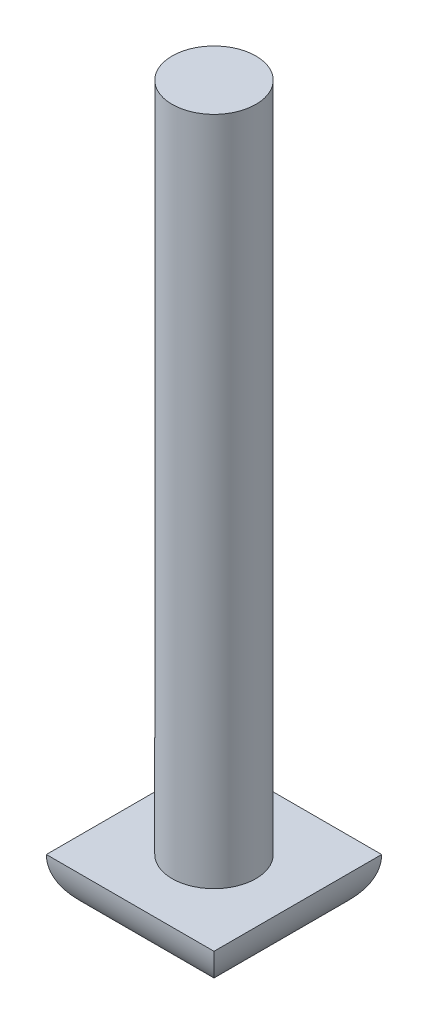
ISO-10303-21;
HEADER;
FILE_DESCRIPTION(('STEP AP214'),'2;1');
FILE_NAME('part.step','',(''),(''),'','','');
FILE_SCHEMA(('AUTOMOTIVE_DESIGN { 1 0 10303 214 1 1 1 1 }'));
ENDSEC;
DATA;
#1=APPLICATION_CONTEXT('core data for automotive mechanical design processes');
#2=APPLICATION_PROTOCOL_DEFINITION('international standard','automotive_design',2000,#1);
#3=PRODUCT_CONTEXT('',#1,'mechanical');
#4=PRODUCT('Part','Part','',(#3));
#5=PRODUCT_RELATED_PRODUCT_CATEGORY('part','',(#4));
#6=PRODUCT_DEFINITION_FORMATION('','',#4);
#7=PRODUCT_DEFINITION_CONTEXT('part definition',#1,'design');
#8=PRODUCT_DEFINITION('design','',#6,#7);
#9=PRODUCT_DEFINITION_SHAPE('','',#8);
#10=(LENGTH_UNIT() NAMED_UNIT(*) SI_UNIT(.MILLI.,.METRE.));
#11=(NAMED_UNIT(*) PLANE_ANGLE_UNIT() SI_UNIT($,.RADIAN.));
#12=(NAMED_UNIT(*) SI_UNIT($,.STERADIAN.) SOLID_ANGLE_UNIT());
#13=UNCERTAINTY_MEASURE_WITH_UNIT(LENGTH_MEASURE(1.E-05),#10,'distance_accuracy_value','');
#14=(GEOMETRIC_REPRESENTATION_CONTEXT(3) GLOBAL_UNCERTAINTY_ASSIGNED_CONTEXT((#13)) GLOBAL_UNIT_ASSIGNED_CONTEXT((#10,
#11,#12)) REPRESENTATION_CONTEXT('',''));
#15=CARTESIAN_POINT('',(0.,0.,0.));
#16=DIRECTION('',(0.,0.,1.));
#17=DIRECTION('',(1.,0.,0.));
#18=AXIS2_PLACEMENT_3D('',#15,#16,#17);
#19=CARTESIAN_POINT('',(0.,8.,0.));
#20=DIRECTION('',(0.,-1.,0.));
#21=DIRECTION('',(0.,0.,-1.));
#22=AXIS2_PLACEMENT_3D('',#19,#20,#21);
#23=PLANE('',#22);
#24=CARTESIAN_POINT('',(0.,8.00000000000001,0.));
#25=DIRECTION('',(0.,-1.,0.));
#26=DIRECTION('',(0.,0.,-1.));
#27=AXIS2_PLACEMENT_3D('',#24,#25,#26);
#28=CIRCLE('',#27,6.);
#29=CARTESIAN_POINT('',(0.,8.00000000000001,-6.));
#30=VERTEX_POINT('',#29);
#31=EDGE_CURVE('E104',#30,#30,#28,.F.);
#32=ORIENTED_EDGE('',*,*,#31,.F.);
#33=EDGE_LOOP('',(#32));
#34=FACE_BOUND('',#33,.T.);
#35=DIRECTION('',(0.,0.,-1.));
#36=VECTOR('',#35,1.);
#37=CARTESIAN_POINT('',(12.,8.,12.));
#38=LINE('',#37,#36);
#39=CARTESIAN_POINT('',(12.,8.,12.));
#40=VERTEX_POINT('',#39);
#41=CARTESIAN_POINT('',(12.,8.,-12.));
#42=VERTEX_POINT('',#41);
#43=EDGE_CURVE('E76',#40,#42,#38,.T.);
#44=ORIENTED_EDGE('',*,*,#43,.T.);
#45=DIRECTION('',(-1.,0.,0.));
#46=VECTOR('',#45,1.);
#47=CARTESIAN_POINT('',(-12.,8.,-12.));
#48=LINE('',#47,#46);
#49=CARTESIAN_POINT('',(-12.,8.,-12.));
#50=VERTEX_POINT('',#49);
#51=EDGE_CURVE('E78',#42,#50,#48,.T.);
#52=ORIENTED_EDGE('',*,*,#51,.T.);
#53=DIRECTION('',(0.,0.,1.));
#54=VECTOR('',#53,1.);
#55=CARTESIAN_POINT('',(-12.,8.,12.));
#56=LINE('',#55,#54);
#57=CARTESIAN_POINT('',(-12.,8.,12.));
#58=VERTEX_POINT('',#57);
#59=EDGE_CURVE('E92',#50,#58,#56,.T.);
#60=ORIENTED_EDGE('',*,*,#59,.T.);
#61=DIRECTION('',(1.,0.,0.));
#62=VECTOR('',#61,1.);
#63=CARTESIAN_POINT('',(-12.,8.,12.));
#64=LINE('',#63,#62);
#65=EDGE_CURVE('E80',#58,#40,#64,.T.);
#66=ORIENTED_EDGE('',*,*,#65,.T.);
#67=EDGE_LOOP('',(#44,#52,#60,#66));
#68=FACE_BOUND('',#67,.T.);
#69=ADVANCED_FACE('F33',(#34,#68),#23,.F.);
#70=CARTESIAN_POINT('',(0.,0.,0.));
#71=DIRECTION('',(0.,-1.,0.));
#72=DIRECTION('',(0.,0.,-1.));
#73=AXIS2_PLACEMENT_3D('',#70,#71,#72);
#74=PLANE('',#73);
#75=DIRECTION('',(0.,0.,-1.));
#76=VECTOR('',#75,1.);
#77=CARTESIAN_POINT('',(4.,0.,12.));
#78=LINE('',#77,#76);
#79=CARTESIAN_POINT('',(4.,0.,-4.));
#80=VERTEX_POINT('',#79);
#81=CARTESIAN_POINT('',(4.,0.,4.));
#82=VERTEX_POINT('',#81);
#83=EDGE_CURVE('E42',#80,#82,#78,.F.);
#84=ORIENTED_EDGE('',*,*,#83,.T.);
#85=DIRECTION('',(1.,0.,0.));
#86=VECTOR('',#85,1.);
#87=CARTESIAN_POINT('',(-12.,0.,4.));
#88=LINE('',#87,#86);
#89=CARTESIAN_POINT('',(-4.,0.,4.));
#90=VERTEX_POINT('',#89);
#91=EDGE_CURVE('E11',#82,#90,#88,.F.);
#92=ORIENTED_EDGE('',*,*,#91,.T.);
#93=DIRECTION('',(0.,0.,1.));
#94=VECTOR('',#93,1.);
#95=CARTESIAN_POINT('',(-4.,0.,-12.));
#96=LINE('',#95,#94);
#97=CARTESIAN_POINT('',(-4.,0.,-4.));
#98=VERTEX_POINT('',#97);
#99=EDGE_CURVE('E100',#90,#98,#96,.F.);
#100=ORIENTED_EDGE('',*,*,#99,.T.);
#101=DIRECTION('',(-1.,0.,0.));
#102=VECTOR('',#101,1.);
#103=CARTESIAN_POINT('',(12.,0.,-4.));
#104=LINE('',#103,#102);
#105=EDGE_CURVE('E102',#98,#80,#104,.F.);
#106=ORIENTED_EDGE('',*,*,#105,.T.);
#107=EDGE_LOOP('',(#84,#92,#100,#106));
#108=FACE_BOUND('',#107,.T.);
#109=ADVANCED_FACE('F117',(#108),#74,.T.);
#110=CARTESIAN_POINT('',(0.,104.,0.));
#111=DIRECTION('',(0.,-1.,0.));
#112=DIRECTION('',(0.,0.,-1.));
#113=AXIS2_PLACEMENT_3D('',#110,#111,#112);
#114=CYLINDRICAL_SURFACE('',#113,6.);
#115=CARTESIAN_POINT('',(0.,104.,0.));
#116=DIRECTION('',(0.,1.,0.));
#117=DIRECTION('',(0.,0.,1.));
#118=AXIS2_PLACEMENT_3D('',#115,#116,#117);
#119=CIRCLE('',#118,6.);
#120=CARTESIAN_POINT('',(0.,104.,6.));
#121=VERTEX_POINT('',#120);
#122=EDGE_CURVE('E84',#121,#121,#119,.T.);
#123=ORIENTED_EDGE('',*,*,#122,.F.);
#124=EDGE_LOOP('',(#123));
#125=FACE_BOUND('',#124,.T.);
#126=ORIENTED_EDGE('',*,*,#31,.T.);
#127=EDGE_LOOP('',(#126));
#128=FACE_BOUND('',#127,.T.);
#129=ADVANCED_FACE('F114',(#125,#128),#114,.T.);
#130=CARTESIAN_POINT('',(0.,104.,0.));
#131=DIRECTION('',(0.,1.,0.));
#132=DIRECTION('',(0.,0.,1.));
#133=AXIS2_PLACEMENT_3D('',#130,#131,#132);
#134=PLANE('',#133);
#135=ORIENTED_EDGE('',*,*,#122,.T.);
#136=EDGE_LOOP('',(#135));
#137=FACE_BOUND('',#136,.T.);
#138=ADVANCED_FACE('F112',(#137),#134,.T.);
#139=CARTESIAN_POINT('',(-12.,8.,-4.));
#140=DIRECTION('',(1.,0.,0.));
#141=DIRECTION('',(0.,0.,-1.));
#142=AXIS2_PLACEMENT_3D('',#139,#140,#141);
#143=CYLINDRICAL_SURFACE('',#142,8.);
#144=CARTESIAN_POINT('',(4.,8.,-4.));
#145=DIRECTION('',(0.707106781186547,0.,0.707106781186547));
#146=DIRECTION('',(0.707106781186547,0.,-0.707106781186547));
#147=AXIS2_PLACEMENT_3D('',#144,#145,#146);
#148=ELLIPSE('',#147,11.3137084989848,8.);
#149=EDGE_CURVE('E89',#80,#42,#148,.T.);
#150=ORIENTED_EDGE('',*,*,#149,.F.);
#151=ORIENTED_EDGE('',*,*,#105,.F.);
#152=CARTESIAN_POINT('',(-4.,8.,-4.));
#153=DIRECTION('',(0.707106781186547,0.,-0.707106781186547));
#154=DIRECTION('',(0.707106781186547,0.,0.707106781186547));
#155=AXIS2_PLACEMENT_3D('',#152,#153,#154);
#156=ELLIPSE('',#155,11.3137084989848,8.);
#157=EDGE_CURVE('E37',#50,#98,#156,.F.);
#158=ORIENTED_EDGE('',*,*,#157,.F.);
#159=ORIENTED_EDGE('',*,*,#51,.F.);
#160=EDGE_LOOP('',(#150,#151,#158,#159));
#161=FACE_BOUND('',#160,.T.);
#162=ADVANCED_FACE('F35',(#161),#143,.T.);
#163=CARTESIAN_POINT('',(-4.,8.,12.));
#164=DIRECTION('',(0.,0.,-1.));
#165=DIRECTION('',(-1.,0.,0.));
#166=AXIS2_PLACEMENT_3D('',#163,#164,#165);
#167=CYLINDRICAL_SURFACE('',#166,8.);
#168=ORIENTED_EDGE('',*,*,#157,.T.);
#169=ORIENTED_EDGE('',*,*,#99,.F.);
#170=CARTESIAN_POINT('',(-4.,8.,4.));
#171=DIRECTION('',(-0.707106781186547,0.,-0.707106781186547));
#172=DIRECTION('',(0.707106781186547,0.,-0.707106781186547));
#173=AXIS2_PLACEMENT_3D('',#170,#171,#172);
#174=ELLIPSE('',#173,11.3137084989848,8.);
#175=EDGE_CURVE('E55',#58,#90,#174,.F.);
#176=ORIENTED_EDGE('',*,*,#175,.F.);
#177=ORIENTED_EDGE('',*,*,#59,.F.);
#178=EDGE_LOOP('',(#168,#169,#176,#177));
#179=FACE_BOUND('',#178,.T.);
#180=ADVANCED_FACE('F133',(#179),#167,.T.);
#181=CARTESIAN_POINT('',(4.,8.,12.));
#182=DIRECTION('',(0.,0.,1.));
#183=DIRECTION('',(1.,0.,0.));
#184=AXIS2_PLACEMENT_3D('',#181,#182,#183);
#185=CYLINDRICAL_SURFACE('',#184,8.);
#186=ORIENTED_EDGE('',*,*,#149,.T.);
#187=ORIENTED_EDGE('',*,*,#43,.F.);
#188=CARTESIAN_POINT('',(4.,8.,4.));
#189=DIRECTION('',(-0.707106781186547,0.,0.707106781186547));
#190=DIRECTION('',(0.707106781186547,0.,0.707106781186547));
#191=AXIS2_PLACEMENT_3D('',#188,#189,#190);
#192=ELLIPSE('',#191,11.3137084989848,8.);
#193=EDGE_CURVE('E95',#82,#40,#192,.T.);
#194=ORIENTED_EDGE('',*,*,#193,.F.);
#195=ORIENTED_EDGE('',*,*,#83,.F.);
#196=EDGE_LOOP('',(#186,#187,#194,#195));
#197=FACE_BOUND('',#196,.T.);
#198=ADVANCED_FACE('F94',(#197),#185,.T.);
#199=CARTESIAN_POINT('',(-12.,8.,4.));
#200=DIRECTION('',(-1.,0.,0.));
#201=DIRECTION('',(0.,0.,1.));
#202=AXIS2_PLACEMENT_3D('',#199,#200,#201);
#203=CYLINDRICAL_SURFACE('',#202,8.);
#204=ORIENTED_EDGE('',*,*,#175,.T.);
#205=ORIENTED_EDGE('',*,*,#91,.F.);
#206=ORIENTED_EDGE('',*,*,#193,.T.);
#207=ORIENTED_EDGE('',*,*,#65,.F.);
#208=EDGE_LOOP('',(#204,#205,#206,#207));
#209=FACE_BOUND('',#208,.T.);
#210=ADVANCED_FACE('F129',(#209),#203,.T.);
#211=CLOSED_SHELL('',(#69,#109,#129,#138,#162,#180,#198,#210));
#212=MANIFOLD_SOLID_BREP('B2',#211);
#213=ADVANCED_BREP_SHAPE_REPRESENTATION('',(#18,#212),#14);
#214=SHAPE_DEFINITION_REPRESENTATION(#9,#213);
ENDSEC;
END-ISO-10303-21;
